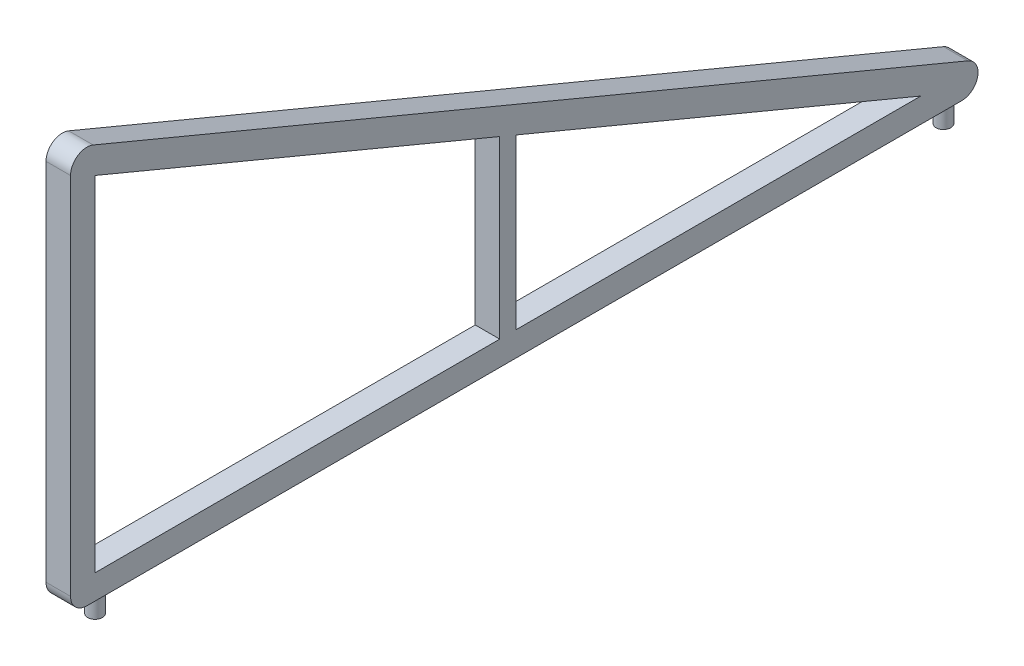
ISO-10303-21;
HEADER;
FILE_DESCRIPTION(('STEP AP214'),'2;1');
FILE_NAME('part.step','',(''),(''),'','','');
FILE_SCHEMA(('AUTOMOTIVE_DESIGN { 1 0 10303 214 1 1 1 1 }'));
ENDSEC;
DATA;
#1=APPLICATION_CONTEXT('core data for automotive mechanical design processes');
#2=APPLICATION_PROTOCOL_DEFINITION('international standard','automotive_design',2000,#1);
#3=PRODUCT_CONTEXT('',#1,'mechanical');
#4=PRODUCT('Part','Part','',(#3));
#5=PRODUCT_RELATED_PRODUCT_CATEGORY('part','',(#4));
#6=PRODUCT_DEFINITION_FORMATION('','',#4);
#7=PRODUCT_DEFINITION_CONTEXT('part definition',#1,'design');
#8=PRODUCT_DEFINITION('design','',#6,#7);
#9=PRODUCT_DEFINITION_SHAPE('','',#8);
#10=(LENGTH_UNIT() NAMED_UNIT(*) SI_UNIT(.MILLI.,.METRE.));
#11=(NAMED_UNIT(*) PLANE_ANGLE_UNIT() SI_UNIT($,.RADIAN.));
#12=(NAMED_UNIT(*) SI_UNIT($,.STERADIAN.) SOLID_ANGLE_UNIT());
#13=UNCERTAINTY_MEASURE_WITH_UNIT(LENGTH_MEASURE(1.E-05),#10,'distance_accuracy_value','');
#14=(GEOMETRIC_REPRESENTATION_CONTEXT(3) GLOBAL_UNCERTAINTY_ASSIGNED_CONTEXT((#13)) GLOBAL_UNIT_ASSIGNED_CONTEXT((#10,
#11,#12)) REPRESENTATION_CONTEXT('',''));
#15=CARTESIAN_POINT('',(0.,0.,0.));
#16=DIRECTION('',(0.,0.,1.));
#17=DIRECTION('',(1.,0.,0.));
#18=AXIS2_PLACEMENT_3D('',#15,#16,#17);
#19=CARTESIAN_POINT('',(31.5,0.,-109.269230769231));
#20=DIRECTION('',(0.,1.,0.));
#21=DIRECTION('',(0.,0.,1.));
#22=AXIS2_PLACEMENT_3D('',#19,#20,#21);
#23=PLANE('',#22);
#24=DIRECTION('',(1.,0.,0.));
#25=VECTOR('',#24,1.);
#26=CARTESIAN_POINT('',(33.,0.,-110.));
#27=LINE('',#26,#25);
#28=CARTESIAN_POINT('',(30.9746655052626,0.,-110.));
#29=VERTEX_POINT('',#28);
#30=CARTESIAN_POINT('',(32.0253344947374,0.,-110.));
#31=VERTEX_POINT('',#30);
#32=EDGE_CURVE('E145',#29,#31,#27,.T.);
#33=ORIENTED_EDGE('',*,*,#32,.T.);
#34=CARTESIAN_POINT('',(31.5,0.,-109.269230769231));
#35=DIRECTION('',(0.,1.,0.));
#36=DIRECTION('',(0.,0.,1.));
#37=AXIS2_PLACEMENT_3D('',#34,#35,#36);
#38=CIRCLE('',#37,0.899999999999996);
#39=EDGE_CURVE('E158',#31,#29,#38,.T.);
#40=ORIENTED_EDGE('',*,*,#39,.T.);
#41=EDGE_LOOP('',(#33,#40));
#42=FACE_BOUND('',#41,.T.);
#43=ADVANCED_FACE('F38',(#42),#23,.T.);
#44=CARTESIAN_POINT('',(30.,3.,0.));
#45=DIRECTION('',(0.,1.,0.));
#46=DIRECTION('',(0.,0.,1.));
#47=AXIS2_PLACEMENT_3D('',#44,#45,#46);
#48=PLANE('',#47);
#49=DIRECTION('',(0.,0.,1.));
#50=VECTOR('',#49,1.);
#51=CARTESIAN_POINT('',(30.,3.,0.));
#52=LINE('',#51,#50);
#53=CARTESIAN_POINT('',(30.,2.99999999999998,-105.));
#54=VERTEX_POINT('',#53);
#55=CARTESIAN_POINT('',(30.,2.99999999999999,-55.5));
#56=VERTEX_POINT('',#55);
#57=EDGE_CURVE('E249',#54,#56,#52,.T.);
#58=ORIENTED_EDGE('',*,*,#57,.T.);
#59=DIRECTION('',(-1.,0.,0.));
#60=VECTOR('',#59,1.);
#61=CARTESIAN_POINT('',(54.5513356765757,2.99999999999999,-55.5));
#62=LINE('',#61,#60);
#63=CARTESIAN_POINT('',(33.,3.,-55.5));
#64=VERTEX_POINT('',#63);
#65=EDGE_CURVE('E262',#64,#56,#62,.T.);
#66=ORIENTED_EDGE('',*,*,#65,.F.);
#67=DIRECTION('',(0.,0.,1.));
#68=VECTOR('',#67,1.);
#69=CARTESIAN_POINT('',(33.,3.,0.));
#70=LINE('',#69,#68);
#71=CARTESIAN_POINT('',(33.,2.99999999999998,-105.));
#72=VERTEX_POINT('',#71);
#73=EDGE_CURVE('E239',#72,#64,#70,.T.);
#74=ORIENTED_EDGE('',*,*,#73,.F.);
#75=DIRECTION('',(1.,0.,0.));
#76=VECTOR('',#75,1.);
#77=CARTESIAN_POINT('',(30.,2.99999999999998,-105.));
#78=LINE('',#77,#76);
#79=EDGE_CURVE('E228',#54,#72,#78,.T.);
#80=ORIENTED_EDGE('',*,*,#79,.F.);
#81=EDGE_LOOP('',(#58,#66,#74,#80));
#82=FACE_BOUND('',#81,.T.);
#83=ADVANCED_FACE('F301',(#82),#48,.T.);
#84=CARTESIAN_POINT('',(30.,39.8343195266272,-16.5976331360947));
#85=DIRECTION('',(0.,0.923076923076923,-0.384615384615385));
#86=DIRECTION('',(0.,0.384615384615385,0.923076923076923));
#87=AXIS2_PLACEMENT_3D('',#84,#85,#86);
#88=PLANE('',#87);
#89=DIRECTION('',(-1.,0.,0.));
#90=VECTOR('',#89,1.);
#91=CARTESIAN_POINT('',(54.5513356765757,23.625,-55.5));
#92=LINE('',#91,#90);
#93=CARTESIAN_POINT('',(33.,23.625,-55.5));
#94=VERTEX_POINT('',#93);
#95=CARTESIAN_POINT('',(30.,23.625,-55.5));
#96=VERTEX_POINT('',#95);
#97=EDGE_CURVE('E259',#94,#96,#92,.T.);
#98=ORIENTED_EDGE('',*,*,#97,.T.);
#99=DIRECTION('',(0.,0.384615384615385,0.923076923076923));
#100=VECTOR('',#99,1.);
#101=CARTESIAN_POINT('',(30.,39.8343195266272,-16.5976331360947));
#102=LINE('',#101,#100);
#103=EDGE_CURVE('E231',#54,#96,#102,.T.);
#104=ORIENTED_EDGE('',*,*,#103,.F.);
#105=ORIENTED_EDGE('',*,*,#79,.T.);
#106=DIRECTION('',(0.,0.384615384615385,0.923076923076923));
#107=VECTOR('',#106,1.);
#108=CARTESIAN_POINT('',(33.,39.8343195266272,-16.5976331360947));
#109=LINE('',#108,#107);
#110=EDGE_CURVE('E232',#72,#94,#109,.T.);
#111=ORIENTED_EDGE('',*,*,#110,.T.);
#112=EDGE_LOOP('',(#98,#104,#105,#111));
#113=FACE_BOUND('',#112,.T.);
#114=ADVANCED_FACE('F307',(#113),#88,.F.);
#115=CARTESIAN_POINT('',(30.,0.,0.));
#116=DIRECTION('',(1.,0.,0.));
#117=DIRECTION('',(0.,0.,-1.));
#118=AXIS2_PLACEMENT_3D('',#115,#116,#117);
#119=PLANE('',#118);
#120=DIRECTION('',(0.,1.,0.));
#121=VECTOR('',#120,1.);
#122=CARTESIAN_POINT('',(30.,0.,-55.5));
#123=LINE('',#122,#121);
#124=EDGE_CURVE('E255',#56,#96,#123,.T.);
#125=ORIENTED_EDGE('',*,*,#124,.F.);
#126=ORIENTED_EDGE('',*,*,#57,.F.);
#127=ORIENTED_EDGE('',*,*,#103,.T.);
#128=EDGE_LOOP('',(#125,#126,#127));
#129=FACE_BOUND('',#128,.T.);
#130=DIRECTION('',(0.,0.,1.));
#131=VECTOR('',#130,1.);
#132=CARTESIAN_POINT('',(30.,0.,0.));
#133=LINE('',#132,#131);
#134=CARTESIAN_POINT('',(30.,0.,-110.));
#135=VERTEX_POINT('',#134);
#136=CARTESIAN_POINT('',(30.,0.,-3.));
#137=VERTEX_POINT('',#136);
#138=EDGE_CURVE('E191',#135,#137,#133,.T.);
#139=ORIENTED_EDGE('',*,*,#138,.T.);
#140=CARTESIAN_POINT('',(30.,2.,-3.));
#141=DIRECTION('',(1.,0.,0.));
#142=DIRECTION('',(0.,0.,-1.));
#143=AXIS2_PLACEMENT_3D('',#140,#141,#142);
#144=CIRCLE('',#143,2.);
#145=CARTESIAN_POINT('',(30.,2.,-1.));
#146=VERTEX_POINT('',#145);
#147=EDGE_CURVE('E172',#137,#146,#144,.F.);
#148=ORIENTED_EDGE('',*,*,#147,.T.);
#149=DIRECTION('',(0.,-1.,0.));
#150=VECTOR('',#149,1.);
#151=CARTESIAN_POINT('',(30.,0.,-1.));
#152=LINE('',#151,#150);
#153=CARTESIAN_POINT('',(30.,46.5833333333333,-1.));
#154=VERTEX_POINT('',#153);
#155=EDGE_CURVE('E195',#154,#146,#152,.T.);
#156=ORIENTED_EDGE('',*,*,#155,.F.);
#157=CARTESIAN_POINT('',(30.,46.5833333333333,-3.));
#158=DIRECTION('',(1.,0.,0.));
#159=DIRECTION('',(0.,0.,-1.));
#160=AXIS2_PLACEMENT_3D('',#157,#158,#159);
#161=CIRCLE('',#160,2.);
#162=CARTESIAN_POINT('',(30.,48.4294871794872,-3.76923076923077));
#163=VERTEX_POINT('',#162);
#164=EDGE_CURVE('E168',#154,#163,#161,.F.);
#165=ORIENTED_EDGE('',*,*,#164,.T.);
#166=DIRECTION('',(0.,0.384615384615385,0.923076923076923));
#167=VECTOR('',#166,1.);
#168=CARTESIAN_POINT('',(30.,42.603550295858,-17.7514792899408));
#169=LINE('',#168,#167);
#170=CARTESIAN_POINT('',(30.,3.84615384615385,-110.769230769231));
#171=VERTEX_POINT('',#170);
#172=EDGE_CURVE('E182',#171,#163,#169,.T.);
#173=ORIENTED_EDGE('',*,*,#172,.F.);
#174=CARTESIAN_POINT('',(30.,2.,-110.));
#175=DIRECTION('',(1.,0.,0.));
#176=DIRECTION('',(0.,0.,-1.));
#177=AXIS2_PLACEMENT_3D('',#174,#175,#176);
#178=CIRCLE('',#177,2.);
#179=EDGE_CURVE('E170',#171,#135,#178,.F.);
#180=ORIENTED_EDGE('',*,*,#179,.T.);
#181=EDGE_LOOP('',(#139,#148,#156,#165,#173,#180));
#182=FACE_BOUND('',#181,.T.);
#183=CARTESIAN_POINT('',(30.,2.99999999999999,-53.5));
#184=VERTEX_POINT('',#183);
#185=CARTESIAN_POINT('',(30.,3.,-4.));
#186=VERTEX_POINT('',#185);
#187=EDGE_CURVE('E234',#184,#186,#52,.T.);
#188=ORIENTED_EDGE('',*,*,#187,.F.);
#189=DIRECTION('',(0.,1.,0.));
#190=VECTOR('',#189,1.);
#191=CARTESIAN_POINT('',(30.,0.,-53.5));
#192=LINE('',#191,#190);
#193=CARTESIAN_POINT('',(30.,24.4583333333333,-53.5));
#194=VERTEX_POINT('',#193);
#195=EDGE_CURVE('E265',#184,#194,#192,.T.);
#196=ORIENTED_EDGE('',*,*,#195,.T.);
#197=CARTESIAN_POINT('',(30.,45.0833333333333,-4.));
#198=VERTEX_POINT('',#197);
#199=EDGE_CURVE('E245',#194,#198,#102,.T.);
#200=ORIENTED_EDGE('',*,*,#199,.T.);
#201=DIRECTION('',(0.,-1.,0.));
#202=VECTOR('',#201,1.);
#203=CARTESIAN_POINT('',(30.,0.,-4.));
#204=LINE('',#203,#202);
#205=EDGE_CURVE('E246',#198,#186,#204,.T.);
#206=ORIENTED_EDGE('',*,*,#205,.T.);
#207=EDGE_LOOP('',(#188,#196,#200,#206));
#208=FACE_BOUND('',#207,.T.);
#209=ADVANCED_FACE('F215',(#129,#182,#208),#119,.F.);
#210=CARTESIAN_POINT('',(33.,0.,0.));
#211=DIRECTION('',(1.,0.,0.));
#212=DIRECTION('',(0.,0.,-1.));
#213=AXIS2_PLACEMENT_3D('',#210,#211,#212);
#214=PLANE('',#213);
#215=ORIENTED_EDGE('',*,*,#73,.T.);
#216=DIRECTION('',(0.,1.,0.));
#217=VECTOR('',#216,1.);
#218=CARTESIAN_POINT('',(33.,0.,-55.5));
#219=LINE('',#218,#217);
#220=EDGE_CURVE('E61',#64,#94,#219,.T.);
#221=ORIENTED_EDGE('',*,*,#220,.T.);
#222=ORIENTED_EDGE('',*,*,#110,.F.);
#223=EDGE_LOOP('',(#215,#221,#222));
#224=FACE_BOUND('',#223,.T.);
#225=DIRECTION('',(0.,-1.,0.));
#226=VECTOR('',#225,1.);
#227=CARTESIAN_POINT('',(33.,0.,-1.));
#228=LINE('',#227,#226);
#229=CARTESIAN_POINT('',(33.,46.5833333333333,-1.));
#230=VERTEX_POINT('',#229);
#231=CARTESIAN_POINT('',(33.,2.,-1.));
#232=VERTEX_POINT('',#231);
#233=EDGE_CURVE('E192',#230,#232,#228,.T.);
#234=ORIENTED_EDGE('',*,*,#233,.T.);
#235=CARTESIAN_POINT('',(33.,2.,-3.));
#236=DIRECTION('',(1.,0.,0.));
#237=DIRECTION('',(0.,0.,-1.));
#238=AXIS2_PLACEMENT_3D('',#235,#236,#237);
#239=CIRCLE('',#238,2.);
#240=CARTESIAN_POINT('',(33.,0.,-3.));
#241=VERTEX_POINT('',#240);
#242=EDGE_CURVE('E150',#232,#241,#239,.T.);
#243=ORIENTED_EDGE('',*,*,#242,.T.);
#244=DIRECTION('',(0.,0.,1.));
#245=VECTOR('',#244,1.);
#246=CARTESIAN_POINT('',(33.,0.,0.));
#247=LINE('',#246,#245);
#248=CARTESIAN_POINT('',(33.,0.,-110.));
#249=VERTEX_POINT('',#248);
#250=EDGE_CURVE('E197',#249,#241,#247,.T.);
#251=ORIENTED_EDGE('',*,*,#250,.F.);
#252=CARTESIAN_POINT('',(33.,2.,-110.));
#253=DIRECTION('',(1.,0.,0.));
#254=DIRECTION('',(0.,0.,-1.));
#255=AXIS2_PLACEMENT_3D('',#252,#253,#254);
#256=CIRCLE('',#255,2.);
#257=CARTESIAN_POINT('',(33.,3.84615384615385,-110.769230769231));
#258=VERTEX_POINT('',#257);
#259=EDGE_CURVE('E147',#249,#258,#256,.T.);
#260=ORIENTED_EDGE('',*,*,#259,.T.);
#261=DIRECTION('',(0.,0.384615384615385,0.923076923076923));
#262=VECTOR('',#261,1.);
#263=CARTESIAN_POINT('',(33.,42.603550295858,-17.7514792899408));
#264=LINE('',#263,#262);
#265=CARTESIAN_POINT('',(33.,48.4294871794872,-3.76923076923077));
#266=VERTEX_POINT('',#265);
#267=EDGE_CURVE('E180',#258,#266,#264,.T.);
#268=ORIENTED_EDGE('',*,*,#267,.T.);
#269=CARTESIAN_POINT('',(33.,46.5833333333333,-3.));
#270=DIRECTION('',(1.,0.,0.));
#271=DIRECTION('',(0.,0.,-1.));
#272=AXIS2_PLACEMENT_3D('',#269,#270,#271);
#273=CIRCLE('',#272,2.);
#274=EDGE_CURVE('E189',#266,#230,#273,.T.);
#275=ORIENTED_EDGE('',*,*,#274,.T.);
#276=EDGE_LOOP('',(#234,#243,#251,#260,#268,#275));
#277=FACE_BOUND('',#276,.T.);
#278=DIRECTION('',(0.,1.,0.));
#279=VECTOR('',#278,1.);
#280=CARTESIAN_POINT('',(33.,0.,-53.5));
#281=LINE('',#280,#279);
#282=CARTESIAN_POINT('',(33.,2.99999999999999,-53.5));
#283=VERTEX_POINT('',#282);
#284=CARTESIAN_POINT('',(33.,24.4583333333333,-53.5));
#285=VERTEX_POINT('',#284);
#286=EDGE_CURVE('E260',#283,#285,#281,.T.);
#287=ORIENTED_EDGE('',*,*,#286,.F.);
#288=CARTESIAN_POINT('',(33.,3.,-4.));
#289=VERTEX_POINT('',#288);
#290=EDGE_CURVE('E242',#283,#289,#70,.T.);
#291=ORIENTED_EDGE('',*,*,#290,.T.);
#292=DIRECTION('',(0.,-1.,0.));
#293=VECTOR('',#292,1.);
#294=CARTESIAN_POINT('',(33.,0.,-4.));
#295=LINE('',#294,#293);
#296=CARTESIAN_POINT('',(33.,45.0833333333333,-4.));
#297=VERTEX_POINT('',#296);
#298=EDGE_CURVE('E236',#297,#289,#295,.T.);
#299=ORIENTED_EDGE('',*,*,#298,.F.);
#300=EDGE_CURVE('E235',#285,#297,#109,.T.);
#301=ORIENTED_EDGE('',*,*,#300,.F.);
#302=EDGE_LOOP('',(#287,#291,#299,#301));
#303=FACE_BOUND('',#302,.T.);
#304=ADVANCED_FACE('F187',(#224,#277,#303),#214,.T.);
#305=CARTESIAN_POINT('',(30.,0.,0.));
#306=DIRECTION('',(0.,1.,0.));
#307=DIRECTION('',(0.,0.,1.));
#308=AXIS2_PLACEMENT_3D('',#305,#306,#307);
#309=PLANE('',#308);
#310=EDGE_CURVE('E53',#135,#29,#27,.T.);
#311=ORIENTED_EDGE('',*,*,#310,.T.);
#312=EDGE_CURVE('E152',#29,#31,#38,.T.);
#313=ORIENTED_EDGE('',*,*,#312,.T.);
#314=EDGE_CURVE('E141',#31,#249,#27,.T.);
#315=ORIENTED_EDGE('',*,*,#314,.T.);
#316=ORIENTED_EDGE('',*,*,#250,.T.);
#317=DIRECTION('',(1.,0.,0.));
#318=VECTOR('',#317,1.);
#319=CARTESIAN_POINT('',(30.,0.,-3.));
#320=LINE('',#319,#318);
#321=EDGE_CURVE('E163',#241,#137,#320,.F.);
#322=ORIENTED_EDGE('',*,*,#321,.T.);
#323=ORIENTED_EDGE('',*,*,#138,.F.);
#324=EDGE_LOOP('',(#311,#313,#315,#316,#322,#323));
#325=FACE_BOUND('',#324,.T.);
#326=CARTESIAN_POINT('',(31.5,0.,-5.5));
#327=DIRECTION('',(0.,1.,0.));
#328=DIRECTION('',(0.,0.,1.));
#329=AXIS2_PLACEMENT_3D('',#326,#327,#328);
#330=CIRCLE('',#329,0.899999999999997);
#331=CARTESIAN_POINT('',(31.5,0.,-4.6));
#332=VERTEX_POINT('',#331);
#333=EDGE_CURVE('E162',#332,#332,#330,.T.);
#334=ORIENTED_EDGE('',*,*,#333,.T.);
#335=EDGE_LOOP('',(#334));
#336=FACE_BOUND('',#335,.T.);
#337=ADVANCED_FACE('F154',(#325,#336),#309,.F.);
#338=CARTESIAN_POINT('',(30.,0.,-1.));
#339=DIRECTION('',(0.,0.,1.));
#340=DIRECTION('',(1.,0.,0.));
#341=AXIS2_PLACEMENT_3D('',#338,#339,#340);
#342=PLANE('',#341);
#343=ORIENTED_EDGE('',*,*,#155,.T.);
#344=DIRECTION('',(1.,0.,0.));
#345=VECTOR('',#344,1.);
#346=CARTESIAN_POINT('',(33.,2.,-1.));
#347=LINE('',#346,#345);
#348=EDGE_CURVE('E203',#146,#232,#347,.T.);
#349=ORIENTED_EDGE('',*,*,#348,.T.);
#350=ORIENTED_EDGE('',*,*,#233,.F.);
#351=DIRECTION('',(1.,0.,0.));
#352=VECTOR('',#351,1.);
#353=CARTESIAN_POINT('',(30.,46.5833333333333,-1.));
#354=LINE('',#353,#352);
#355=EDGE_CURVE('E201',#230,#154,#354,.F.);
#356=ORIENTED_EDGE('',*,*,#355,.T.);
#357=EDGE_LOOP('',(#343,#349,#350,#356));
#358=FACE_BOUND('',#357,.T.);
#359=ADVANCED_FACE('F218',(#358),#342,.T.);
#360=CARTESIAN_POINT('',(30.,42.603550295858,-17.7514792899408));
#361=DIRECTION('',(0.,0.923076923076923,-0.384615384615385));
#362=DIRECTION('',(0.,0.384615384615385,0.923076923076923));
#363=AXIS2_PLACEMENT_3D('',#360,#361,#362);
#364=PLANE('',#363);
#365=ORIENTED_EDGE('',*,*,#267,.F.);
#366=DIRECTION('',(1.,0.,0.));
#367=VECTOR('',#366,1.);
#368=CARTESIAN_POINT('',(30.,3.84615384615385,-110.769230769231));
#369=LINE('',#368,#367);
#370=EDGE_CURVE('E12',#258,#171,#369,.F.);
#371=ORIENTED_EDGE('',*,*,#370,.T.);
#372=ORIENTED_EDGE('',*,*,#172,.T.);
#373=DIRECTION('',(1.,0.,0.));
#374=VECTOR('',#373,1.);
#375=CARTESIAN_POINT('',(30.,48.4294871794872,-3.76923076923077));
#376=LINE('',#375,#374);
#377=EDGE_CURVE('E46',#163,#266,#376,.T.);
#378=ORIENTED_EDGE('',*,*,#377,.T.);
#379=EDGE_LOOP('',(#365,#371,#372,#378));
#380=FACE_BOUND('',#379,.T.);
#381=ADVANCED_FACE('F179',(#380),#364,.T.);
#382=DIRECTION('',(-1.,0.,0.));
#383=VECTOR('',#382,1.);
#384=CARTESIAN_POINT('',(54.5513356765757,2.99999999999999,-53.5));
#385=LINE('',#384,#383);
#386=EDGE_CURVE('E252',#283,#184,#385,.T.);
#387=ORIENTED_EDGE('',*,*,#386,.T.);
#388=ORIENTED_EDGE('',*,*,#187,.T.);
#389=DIRECTION('',(1.,0.,0.));
#390=VECTOR('',#389,1.);
#391=CARTESIAN_POINT('',(30.,3.,-4.));
#392=LINE('',#391,#390);
#393=EDGE_CURVE('E209',#186,#289,#392,.T.);
#394=ORIENTED_EDGE('',*,*,#393,.T.);
#395=ORIENTED_EDGE('',*,*,#290,.F.);
#396=EDGE_LOOP('',(#387,#388,#394,#395));
#397=FACE_BOUND('',#396,.T.);
#398=ADVANCED_FACE('F310',(#397),#48,.T.);
#399=CARTESIAN_POINT('',(30.,0.,-4.));
#400=DIRECTION('',(0.,0.,1.));
#401=DIRECTION('',(1.,0.,0.));
#402=AXIS2_PLACEMENT_3D('',#399,#400,#401);
#403=PLANE('',#402);
#404=ORIENTED_EDGE('',*,*,#298,.T.);
#405=ORIENTED_EDGE('',*,*,#393,.F.);
#406=ORIENTED_EDGE('',*,*,#205,.F.);
#407=DIRECTION('',(1.,0.,0.));
#408=VECTOR('',#407,1.);
#409=CARTESIAN_POINT('',(30.,45.0833333333333,-4.));
#410=LINE('',#409,#408);
#411=EDGE_CURVE('E225',#198,#297,#410,.T.);
#412=ORIENTED_EDGE('',*,*,#411,.T.);
#413=EDGE_LOOP('',(#404,#405,#406,#412));
#414=FACE_BOUND('',#413,.T.);
#415=ADVANCED_FACE('F319',(#414),#403,.F.);
#416=ORIENTED_EDGE('',*,*,#199,.F.);
#417=DIRECTION('',(-1.,0.,0.));
#418=VECTOR('',#417,1.);
#419=CARTESIAN_POINT('',(54.5513356765757,24.4583333333333,-53.5));
#420=LINE('',#419,#418);
#421=EDGE_CURVE('E256',#285,#194,#420,.T.);
#422=ORIENTED_EDGE('',*,*,#421,.F.);
#423=ORIENTED_EDGE('',*,*,#300,.T.);
#424=ORIENTED_EDGE('',*,*,#411,.F.);
#425=EDGE_LOOP('',(#416,#422,#423,#424));
#426=FACE_BOUND('',#425,.T.);
#427=ADVANCED_FACE('F316',(#426),#88,.F.);
#428=CARTESIAN_POINT('',(30.,2.,-3.));
#429=DIRECTION('',(-1.,0.,0.));
#430=DIRECTION('',(0.,0.,1.));
#431=AXIS2_PLACEMENT_3D('',#428,#429,#430);
#432=CYLINDRICAL_SURFACE('',#431,2.);
#433=ORIENTED_EDGE('',*,*,#147,.F.);
#434=ORIENTED_EDGE('',*,*,#321,.F.);
#435=ORIENTED_EDGE('',*,*,#242,.F.);
#436=ORIENTED_EDGE('',*,*,#348,.F.);
#437=EDGE_LOOP('',(#433,#434,#435,#436));
#438=FACE_BOUND('',#437,.T.);
#439=ADVANCED_FACE('F211',(#438),#432,.T.);
#440=CARTESIAN_POINT('',(30.,2.,-110.));
#441=DIRECTION('',(-1.,0.,0.));
#442=DIRECTION('',(0.,0.,1.));
#443=AXIS2_PLACEMENT_3D('',#440,#441,#442);
#444=CYLINDRICAL_SURFACE('',#443,2.);
#445=ORIENTED_EDGE('',*,*,#179,.F.);
#446=ORIENTED_EDGE('',*,*,#370,.F.);
#447=ORIENTED_EDGE('',*,*,#259,.F.);
#448=ORIENTED_EDGE('',*,*,#314,.F.);
#449=ORIENTED_EDGE('',*,*,#32,.F.);
#450=ORIENTED_EDGE('',*,*,#310,.F.);
#451=EDGE_LOOP('',(#445,#446,#447,#448,#449,#450));
#452=FACE_BOUND('',#451,.T.);
#453=ADVANCED_FACE('F143',(#452),#444,.T.);
#454=CARTESIAN_POINT('',(30.,46.5833333333333,-3.));
#455=DIRECTION('',(1.,0.,0.));
#456=DIRECTION('',(0.,0.,-1.));
#457=AXIS2_PLACEMENT_3D('',#454,#455,#456);
#458=CYLINDRICAL_SURFACE('',#457,2.);
#459=ORIENTED_EDGE('',*,*,#164,.F.);
#460=ORIENTED_EDGE('',*,*,#355,.F.);
#461=ORIENTED_EDGE('',*,*,#274,.F.);
#462=ORIENTED_EDGE('',*,*,#377,.F.);
#463=EDGE_LOOP('',(#459,#460,#461,#462));
#464=FACE_BOUND('',#463,.T.);
#465=ADVANCED_FACE('F40',(#464),#458,.T.);
#466=CARTESIAN_POINT('',(54.5513356765757,0.,-53.5));
#467=DIRECTION('',(0.,0.,1.));
#468=DIRECTION('',(1.,0.,0.));
#469=AXIS2_PLACEMENT_3D('',#466,#467,#468);
#470=PLANE('',#469);
#471=ORIENTED_EDGE('',*,*,#386,.F.);
#472=ORIENTED_EDGE('',*,*,#286,.T.);
#473=ORIENTED_EDGE('',*,*,#421,.T.);
#474=ORIENTED_EDGE('',*,*,#195,.F.);
#475=EDGE_LOOP('',(#471,#472,#473,#474));
#476=FACE_BOUND('',#475,.T.);
#477=ADVANCED_FACE('F374',(#476),#470,.T.);
#478=CARTESIAN_POINT('',(54.5513356765757,0.,-55.5));
#479=DIRECTION('',(0.,0.,1.));
#480=DIRECTION('',(0.,-1.,0.));
#481=AXIS2_PLACEMENT_3D('',#478,#479,#480);
#482=PLANE('',#481);
#483=ORIENTED_EDGE('',*,*,#220,.F.);
#484=ORIENTED_EDGE('',*,*,#65,.T.);
#485=ORIENTED_EDGE('',*,*,#124,.T.);
#486=ORIENTED_EDGE('',*,*,#97,.F.);
#487=EDGE_LOOP('',(#483,#484,#485,#486));
#488=FACE_BOUND('',#487,.T.);
#489=ADVANCED_FACE('F423',(#488),#482,.F.);
#490=CARTESIAN_POINT('',(31.5,-116.72400944832,-109.269230769231));
#491=DIRECTION('',(0.,1.,0.));
#492=DIRECTION('',(0.,0.,1.));
#493=AXIS2_PLACEMENT_3D('',#490,#491,#492);
#494=CYLINDRICAL_SURFACE('',#493,0.899999999999996);
#495=CARTESIAN_POINT('',(31.5,-2.8,-109.269230769231));
#496=DIRECTION('',(0.,1.,0.));
#497=DIRECTION('',(0.,0.,1.));
#498=AXIS2_PLACEMENT_3D('',#495,#496,#497);
#499=CIRCLE('',#498,0.899999999999996);
#500=CARTESIAN_POINT('',(31.5,-2.8,-108.369230769231));
#501=VERTEX_POINT('',#500);
#502=EDGE_CURVE('E266',#501,#501,#499,.F.);
#503=ORIENTED_EDGE('',*,*,#502,.F.);
#504=EDGE_LOOP('',(#503));
#505=FACE_BOUND('',#504,.T.);
#506=ORIENTED_EDGE('',*,*,#39,.F.);
#507=ORIENTED_EDGE('',*,*,#312,.F.);
#508=EDGE_LOOP('',(#506,#507));
#509=FACE_BOUND('',#508,.T.);
#510=ADVANCED_FACE('F160',(#505,#509),#494,.T.);
#511=CARTESIAN_POINT('',(31.5,-2.8,-109.269230769231));
#512=DIRECTION('',(0.,1.,0.));
#513=DIRECTION('',(0.,0.,1.));
#514=AXIS2_PLACEMENT_3D('',#511,#512,#513);
#515=PLANE('',#514);
#516=ORIENTED_EDGE('',*,*,#502,.T.);
#517=EDGE_LOOP('',(#516));
#518=FACE_BOUND('',#517,.T.);
#519=ADVANCED_FACE('F286',(#518),#515,.F.);
#520=CARTESIAN_POINT('',(31.5,-116.72400944832,-5.5));
#521=DIRECTION('',(0.,1.,0.));
#522=DIRECTION('',(0.,0.,1.));
#523=AXIS2_PLACEMENT_3D('',#520,#521,#522);
#524=CYLINDRICAL_SURFACE('',#523,0.899999999999997);
#525=CARTESIAN_POINT('',(31.5,-2.8,-5.5));
#526=DIRECTION('',(0.,1.,0.));
#527=DIRECTION('',(0.,0.,1.));
#528=AXIS2_PLACEMENT_3D('',#525,#526,#527);
#529=CIRCLE('',#528,0.899999999999997);
#530=CARTESIAN_POINT('',(31.5,-2.8,-4.6));
#531=VERTEX_POINT('',#530);
#532=EDGE_CURVE('E275',#531,#531,#529,.F.);
#533=CARTESIAN_POINT('',(31.5,-2.8,-4.6));
#534=CARTESIAN_POINT('',(31.5,-2.77083333333333,-4.6));
#535=CARTESIAN_POINT('',(31.5,-2.74166666666666,-4.6));
#536=CARTESIAN_POINT('',(31.5,-2.68333333333333,-4.6));
#537=CARTESIAN_POINT('',(31.5,-2.65416666666667,-4.6));
#538=CARTESIAN_POINT('',(31.5,-2.59583333333333,-4.6));
#539=CARTESIAN_POINT('',(31.5,-2.56666666666667,-4.6));
#540=CARTESIAN_POINT('',(31.5,-2.50833333333333,-4.6));
#541=CARTESIAN_POINT('',(31.5,-2.47916666666666,-4.6));
#542=CARTESIAN_POINT('',(31.5,-2.42083333333333,-4.6));
#543=CARTESIAN_POINT('',(31.5,-2.39166666666667,-4.6));
#544=CARTESIAN_POINT('',(31.5,-2.33333333333334,-4.6));
#545=CARTESIAN_POINT('',(31.5,-2.30416666666667,-4.6));
#546=CARTESIAN_POINT('',(31.5,-2.24583333333333,-4.6));
#547=CARTESIAN_POINT('',(31.5,-2.21666666666666,-4.6));
#548=CARTESIAN_POINT('',(31.5,-2.15833333333333,-4.6));
#549=CARTESIAN_POINT('',(31.5,-2.12916666666666,-4.6));
#550=CARTESIAN_POINT('',(31.5,-2.07083333333333,-4.6));
#551=CARTESIAN_POINT('',(31.5,-2.04166666666666,-4.6));
#552=CARTESIAN_POINT('',(31.5,-1.98333333333333,-4.6));
#553=CARTESIAN_POINT('',(31.5,-1.95416666666666,-4.6));
#554=CARTESIAN_POINT('',(31.5,-1.89583333333333,-4.6));
#555=CARTESIAN_POINT('',(31.5,-1.86666666666666,-4.6));
#556=CARTESIAN_POINT('',(31.5,-1.80833333333333,-4.6));
#557=CARTESIAN_POINT('',(31.5,-1.77916666666667,-4.6));
#558=CARTESIAN_POINT('',(31.5,-1.72083333333333,-4.6));
#559=CARTESIAN_POINT('',(31.5,-1.69166666666667,-4.6));
#560=CARTESIAN_POINT('',(31.5,-1.63333333333333,-4.6));
#561=CARTESIAN_POINT('',(31.5,-1.60416666666666,-4.6));
#562=CARTESIAN_POINT('',(31.5,-1.54583333333333,-4.6));
#563=CARTESIAN_POINT('',(31.5,-1.51666666666667,-4.6));
#564=CARTESIAN_POINT('',(31.5,-1.45833333333333,-4.6));
#565=CARTESIAN_POINT('',(31.5,-1.42916666666667,-4.6));
#566=CARTESIAN_POINT('',(31.5,-1.37083333333333,-4.6));
#567=CARTESIAN_POINT('',(31.5,-1.34166666666666,-4.6));
#568=CARTESIAN_POINT('',(31.5,-1.28333333333333,-4.6));
#569=CARTESIAN_POINT('',(31.5,-1.25416666666667,-4.6));
#570=CARTESIAN_POINT('',(31.5,-1.19583333333334,-4.6));
#571=CARTESIAN_POINT('',(31.5,-1.16666666666667,-4.6));
#572=CARTESIAN_POINT('',(31.5,-1.10833333333333,-4.6));
#573=CARTESIAN_POINT('',(31.5,-1.07916666666666,-4.6));
#574=CARTESIAN_POINT('',(31.5,-1.02083333333333,-4.6));
#575=CARTESIAN_POINT('',(31.5,-0.991666666666668,-4.6));
#576=CARTESIAN_POINT('',(31.5,-0.933333333333337,-4.6));
#577=CARTESIAN_POINT('',(31.5,-0.904166666666669,-4.6));
#578=CARTESIAN_POINT('',(31.5,-0.845833333333333,-4.6));
#579=CARTESIAN_POINT('',(31.5,-0.816666666666665,-4.6));
#580=CARTESIAN_POINT('',(31.5,-0.758333333333333,-4.6));
#581=CARTESIAN_POINT('',(31.5,-0.72916666666667,-4.6));
#582=CARTESIAN_POINT('',(31.5,-0.670833333333338,-4.6));
#583=CARTESIAN_POINT('',(31.5,-0.64166666666667,-4.6));
#584=CARTESIAN_POINT('',(31.5,-0.583333333333334,-4.6));
#585=CARTESIAN_POINT('',(31.5,-0.554166666666666,-4.6));
#586=CARTESIAN_POINT('',(31.5,-0.49583333333333,-4.6));
#587=CARTESIAN_POINT('',(31.5,-0.466666666666662,-4.6));
#588=CARTESIAN_POINT('',(31.5,-0.40833333333333,-4.6));
#589=CARTESIAN_POINT('',(31.5,-0.379166666666667,-4.6));
#590=CARTESIAN_POINT('',(31.5,-0.320833333333335,-4.6));
#591=CARTESIAN_POINT('',(31.5,-0.291666666666667,-4.6));
#592=CARTESIAN_POINT('',(31.5,-0.233333333333331,-4.6));
#593=CARTESIAN_POINT('',(31.5,-0.204166666666663,-4.6));
#594=CARTESIAN_POINT('',(31.5,-0.145833333333331,-4.6));
#595=CARTESIAN_POINT('',(31.5,-0.116666666666668,-4.6));
#596=CARTESIAN_POINT('',(31.5,-0.0583333333333362,-4.6));
#597=CARTESIAN_POINT('',(31.5,-0.0291666666666681,-4.6));
#598=CARTESIAN_POINT('',(31.5,0.,-4.6));
#599=B_SPLINE_CURVE_WITH_KNOTS('',3,(#533,#534,#535,#536,#537,#538,#539,#540,#541,#542,#543,
#544,#545,#546,#547,#548,#549,#550,#551,#552,#553,#554,#555,#556,#557,#558,#559,#560,#561,#562,
#563,#564,#565,#566,#567,#568,#569,#570,#571,#572,#573,#574,#575,#576,#577,#578,#579,#580,#581,
#582,#583,#584,#585,#586,#587,#588,#589,#590,#591,#592,#593,#594,#595,#596,#597,#598),
.UNSPECIFIED.,.F.,.F.,(4,2,2,2,2,2,2,2,2,2,2,2,2,2,2,2,2,2,2,2,2,2,2,2,2,2,2,2,2,2,2,2,4),(0.,
0.0875000000000042,0.174999999999995,0.262499999999999,0.350000000000003,0.437499999999993,
0.524999999999998,0.612500000000002,0.700000000000006,0.787499999999997,0.875000000000001,
0.962500000000005,1.05,1.1375,1.225,1.31249999999999,1.4,1.4875,1.57499999999999,1.6625,1.75,
1.83749999999999,1.925,2.0125,2.09999999999999,2.1875,2.275,2.3625,2.44999999999999,2.5375,
2.625,2.71249999999999,2.8),.UNSPECIFIED.);
#600=EDGE_CURVE('BSEAM283',#531,#332,#599,.T.);
#601=ORIENTED_EDGE('',*,*,#532,.F.);
#602=ORIENTED_EDGE('',*,*,#333,.F.);
#603=ORIENTED_EDGE('',*,*,#600,.T.);
#604=ORIENTED_EDGE('',*,*,#600,.F.);
#605=EDGE_LOOP('',(#601,#603,#602,#604));
#606=FACE_BOUND('',#605,.T.);
#607=ADVANCED_FACE('F283',(#606),#524,.T.);
#608=CARTESIAN_POINT('',(31.5,-2.8,-5.5));
#609=DIRECTION('',(0.,1.,0.));
#610=DIRECTION('',(0.,0.,1.));
#611=AXIS2_PLACEMENT_3D('',#608,#609,#610);
#612=PLANE('',#611);
#613=ORIENTED_EDGE('',*,*,#532,.T.);
#614=EDGE_LOOP('',(#613));
#615=FACE_BOUND('',#614,.T.);
#616=ADVANCED_FACE('F281',(#615),#612,.F.);
#617=CLOSED_SHELL('',(#43,#83,#114,#209,#304,#337,#359,#381,#398,#415,#427,#439,#453,#465,#477,
#489,#510,#519,#607,#616));
#618=MANIFOLD_SOLID_BREP('B2',#617);
#619=ADVANCED_BREP_SHAPE_REPRESENTATION('',(#18,#618),#14);
#620=SHAPE_DEFINITION_REPRESENTATION(#9,#619);
ENDSEC;
END-ISO-10303-21;
